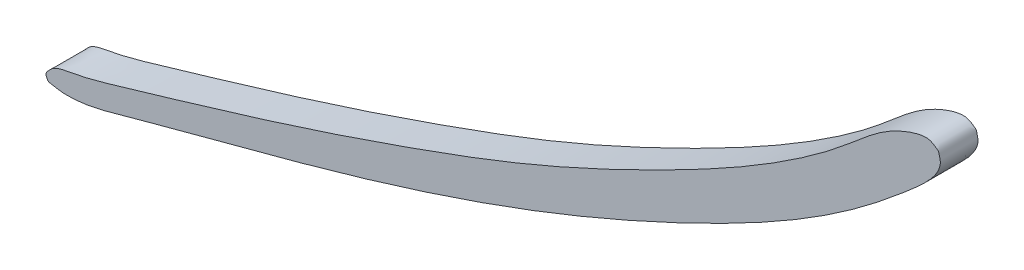
ISO-10303-21;
HEADER;
FILE_DESCRIPTION(('STEP AP214'),'2;1');
FILE_NAME('part.step','',(''),(''),'','','');
FILE_SCHEMA(('AUTOMOTIVE_DESIGN { 1 0 10303 214 1 1 1 1 }'));
ENDSEC;
DATA;
#1=APPLICATION_CONTEXT('core data for automotive mechanical design processes');
#2=APPLICATION_PROTOCOL_DEFINITION('international standard','automotive_design',2000,#1);
#3=PRODUCT_CONTEXT('',#1,'mechanical');
#4=PRODUCT('Part','Part','',(#3));
#5=PRODUCT_RELATED_PRODUCT_CATEGORY('part','',(#4));
#6=PRODUCT_DEFINITION_FORMATION('','',#4);
#7=PRODUCT_DEFINITION_CONTEXT('part definition',#1,'design');
#8=PRODUCT_DEFINITION('design','',#6,#7);
#9=PRODUCT_DEFINITION_SHAPE('','',#8);
#10=(LENGTH_UNIT() NAMED_UNIT(*) SI_UNIT(.MILLI.,.METRE.));
#11=(NAMED_UNIT(*) PLANE_ANGLE_UNIT() SI_UNIT($,.RADIAN.));
#12=(NAMED_UNIT(*) SI_UNIT($,.STERADIAN.) SOLID_ANGLE_UNIT());
#13=UNCERTAINTY_MEASURE_WITH_UNIT(LENGTH_MEASURE(1.E-05),#10,'distance_accuracy_value','');
#14=(GEOMETRIC_REPRESENTATION_CONTEXT(3) GLOBAL_UNCERTAINTY_ASSIGNED_CONTEXT((#13)) GLOBAL_UNIT_ASSIGNED_CONTEXT((#10,
#11,#12)) REPRESENTATION_CONTEXT('',''));
#15=CARTESIAN_POINT('',(0.,0.,0.));
#16=DIRECTION('',(0.,0.,1.));
#17=DIRECTION('',(1.,0.,0.));
#18=AXIS2_PLACEMENT_3D('',#15,#16,#17);
#19=CARTESIAN_POINT('',(99.7842307095506,0.,188.));
#20=CARTESIAN_POINT('',(99.7131256875294,0.123254902032743,188.));
#21=CARTESIAN_POINT('',(99.601604895818,0.211627373297266,188.));
#22=CARTESIAN_POINT('',(99.3732442418728,0.374850026542886,188.));
#23=CARTESIAN_POINT('',(99.2541942500146,0.449183163500999,188.));
#24=CARTESIAN_POINT('',(99.0199318074573,0.603585017392203,188.));
#25=CARTESIAN_POINT('',(98.904103343236,0.682733041966382,188.));
#26=CARTESIAN_POINT('',(98.6663586725593,0.831930365914809,188.));
#27=CARTESIAN_POINT('',(98.544956132999,0.90217971931451,188.));
#28=CARTESIAN_POINT('',(98.2971974452133,1.02952206028731,188.));
#29=CARTESIAN_POINT('',(98.1704216067928,1.0863098855114,188.));
#30=CARTESIAN_POINT('',(97.9064295213056,1.17507453193224,188.));
#31=CARTESIAN_POINT('',(97.7682613757328,1.20809529123866,188.));
#32=CARTESIAN_POINT('',(97.3515697743637,1.27532921795946,188.));
#33=CARTESIAN_POINT('',(97.0729715951632,1.27911444627443,188.));
#34=CARTESIAN_POINT('',(96.5149921440858,1.24670362989211,188.));
#35=CARTESIAN_POINT('',(96.2355446625707,1.20917354148847,188.));
#36=CARTESIAN_POINT('',(95.6863130491497,1.1147146675004,188.));
#37=CARTESIAN_POINT('',(95.4148553482006,1.0565727904916,188.));
#38=CARTESIAN_POINT('',(94.6088222964166,0.85332915467946,188.));
#39=CARTESIAN_POINT('',(94.0817867101929,0.682174680970332,188.));
#40=CARTESIAN_POINT('',(93.0374340600245,0.306284593648871,188.));
#41=CARTESIAN_POINT('',(92.5193166450772,0.0982730212970454,188.));
#42=CARTESIAN_POINT('',(91.502323377133,-0.347867772123381,188.));
#43=CARTESIAN_POINT('',(91.0030261073154,-0.585418903489212,188.));
#44=CARTESIAN_POINT('',(89.5312304921133,-1.33915036103909,188.));
#45=CARTESIAN_POINT('',(88.5857149151656,-1.89780430860008,188.));
#46=CARTESIAN_POINT('',(85.850684718822,-3.73356349972479,188.));
#47=CARTESIAN_POINT('',(84.153381279216,-5.15616301506977,188.));
#48=CARTESIAN_POINT('',(81.6205654773531,-7.30916548573409,188.));
#49=CARTESIAN_POINT('',(80.7769218901046,-8.02779130474312,188.));
#50=CARTESIAN_POINT('',(79.074973145826,-9.4426817140586,188.));
#51=CARTESIAN_POINT('',(78.2178197139216,-10.1407028685886,188.));
#52=CARTESIAN_POINT('',(75.6148030425224,-12.1866378340533,188.));
#53=CARTESIAN_POINT('',(73.8396407774922,-13.4898659653157,188.));
#54=CARTESIAN_POINT('',(70.2377976098437,-16.0177481014187,188.));
#55=CARTESIAN_POINT('',(68.4109156268312,-17.2420954266373,188.));
#56=CARTESIAN_POINT('',(64.7176541545496,-19.6305500902421,188.));
#57=CARTESIAN_POINT('',(62.8501320931751,-20.7929148242182,188.));
#58=CARTESIAN_POINT('',(59.0756226574838,-23.057453405269,188.));
#59=CARTESIAN_POINT('',(57.1691266308624,-24.1603766358237,188.));
#60=CARTESIAN_POINT('',(53.3255113926452,-26.3195178632503,188.));
#61=CARTESIAN_POINT('',(51.3886311299022,-27.3761002951738,188.));
#62=CARTESIAN_POINT('',(47.4927164612019,-29.4554765626764,188.));
#63=CARTESIAN_POINT('',(45.5329225397239,-30.4782096549606,188.));
#64=CARTESIAN_POINT('',(39.6319997126305,-33.501204666838,188.));
#65=CARTESIAN_POINT('',(35.6665994422997,-35.4557603251591,188.));
#66=CARTESIAN_POINT('',(27.6877225915225,-39.2592702868246,188.));
#67=CARTESIAN_POINT('',(23.6744171016101,-41.1090121566025,188.));
#68=CARTESIAN_POINT('',(15.5840408505414,-44.6695332628869,188.));
#69=CARTESIAN_POINT('',(11.5052711721854,-46.3764778406774,188.));
#70=CARTESIAN_POINT('',(3.29269973755621,-49.6419268020293,188.));
#71=CARTESIAN_POINT('',(-0.841544101254448,-51.2033575819866,188.));
#72=CARTESIAN_POINT('',(-9.14298718641138,-54.242182274037,188.));
#73=CARTESIAN_POINT('',(-13.3074882168016,-55.7214182871307,188.));
#74=CARTESIAN_POINT('',(-21.6541295206776,-58.6263659252816,188.));
#75=CARTESIAN_POINT('',(-25.8371504745589,-60.0499029227589,188.));
#76=CARTESIAN_POINT('',(-34.2269979369363,-62.8259629337181,188.));
#77=CARTESIAN_POINT('',(-38.4339868967335,-64.1780013412219,188.));
#78=CARTESIAN_POINT('',(-46.8694283241486,-66.8180506960207,188.));
#79=CARTESIAN_POINT('',(-51.0974568812443,-68.107524457408,188.));
#80=CARTESIAN_POINT('',(-57.445816612963,-70.0194867218374,188.));
#81=CARTESIAN_POINT('',(-59.5630118629135,-70.653234968966,188.));
#82=CARTESIAN_POINT('',(-63.7979782741448,-71.9187941535666,188.));
#83=CARTESIAN_POINT('',(-65.9157496665391,-72.5506126440865,188.));
#84=CARTESIAN_POINT('',(-70.1530695373074,-73.8082664770458,188.));
#85=CARTESIAN_POINT('',(-72.272866084248,-74.4332591788246,188.));
#86=CARTESIAN_POINT('',(-75.4554102007939,-75.3610160285518,188.));
#87=CARTESIAN_POINT('',(-76.5160491618543,-75.6710668354232,188.));
#88=CARTESIAN_POINT('',(-78.6412754197292,-76.2769712689468,188.));
#89=CARTESIAN_POINT('',(-79.7072415266158,-76.5693403689131,188.));
#90=CARTESIAN_POINT('',(-81.3183996551675,-76.9593978244111,188.));
#91=CARTESIAN_POINT('',(-81.8570399022285,-77.0816631503639,188.));
#92=CARTESIAN_POINT('',(-82.9379374369105,-77.3085275097041,188.));
#93=CARTESIAN_POINT('',(-83.4804576501506,-77.4118423659221,188.));
#94=CARTESIAN_POINT('',(-84.5684537011718,-77.6040362635022,188.));
#95=CARTESIAN_POINT('',(-85.1133468107151,-77.6957614569497,188.));
#96=CARTESIAN_POINT('',(-85.9240099513167,-77.8659586191418,188.));
#97=CARTESIAN_POINT('',(-86.1933039971211,-77.9278241316213,188.));
#98=CARTESIAN_POINT('',(-86.7259245508629,-78.0679778104867,188.));
#99=CARTESIAN_POINT('',(-86.9896589540913,-78.1457486894914,188.));
#100=CARTESIAN_POINT('',(-87.5069717319422,-78.3316261303947,188.));
#101=CARTESIAN_POINT('',(-87.7618125824687,-78.4401083865574,188.));
#102=CARTESIAN_POINT('',(-88.2494486182274,-78.7052487142106,188.));
#103=CARTESIAN_POINT('',(-88.4745685101383,-78.860474530986,188.));
#104=CARTESIAN_POINT('',(-88.8873467186841,-79.2163166196969,188.));
#105=CARTESIAN_POINT('',(-89.0776869242753,-79.4136833710369,188.));
#106=CARTESIAN_POINT('',(-89.3515667765894,-79.723825582829,188.));
#107=CARTESIAN_POINT('',(-89.4434616450909,-79.8268206135513,188.));
#108=CARTESIAN_POINT('',(-89.573034610072,-79.9877259549994,188.));
#109=CARTESIAN_POINT('',(-89.6149086705801,-80.0423921265352,188.));
#110=CARTESIAN_POINT('',(-89.6920701464662,-80.156881328784,188.));
#111=CARTESIAN_POINT('',(-89.727408079426,-80.2177549976445,188.));
#112=CARTESIAN_POINT('',(-89.7789777985659,-80.3459510228897,188.));
#113=CARTESIAN_POINT('',(-89.7945655033695,-80.4151381166068,188.));
#114=CARTESIAN_POINT('',(-89.8007362395885,-80.5534027604245,188.));
#115=CARTESIAN_POINT('',(-89.79304806357,-80.6232823195014,188.));
#116=CARTESIAN_POINT('',(-89.7511794046847,-80.8266782955336,188.));
#117=CARTESIAN_POINT('',(-89.7020920328425,-80.9550204772416,188.));
#118=CARTESIAN_POINT('',(-89.594539651813,-81.2084917947264,188.));
#119=CARTESIAN_POINT('',(-89.5353022284484,-81.3340936066089,188.));
#120=CARTESIAN_POINT('',(-89.4140825340137,-81.5023599879631,188.));
#121=CARTESIAN_POINT('',(-89.3675251553206,-81.5536706551477,188.));
#122=CARTESIAN_POINT('',(-89.2607746797731,-81.6401861824673,188.));
#123=CARTESIAN_POINT('',(-89.2002514914872,-81.6756435888439,188.));
#124=CARTESIAN_POINT('',(-89.0091422032274,-81.7513215700416,188.));
#125=CARTESIAN_POINT('',(-88.8700203294141,-81.7696148585663,188.));
#126=CARTESIAN_POINT('',(-88.5968237426901,-81.8061456064523,188.));
#127=CARTESIAN_POINT('',(-88.4602191518904,-81.8243726099333,188.));
#128=CARTESIAN_POINT('',(-88.0525311576045,-81.8920060451256,188.));
#129=CARTESIAN_POINT('',(-87.7820737999529,-81.9462485517196,188.));
#130=CARTESIAN_POINT('',(-87.2402843051619,-82.0493450573704,188.));
#131=CARTESIAN_POINT('',(-86.9690134595939,-82.0955180439386,188.));
#132=CARTESIAN_POINT('',(-86.4245497545988,-82.1603942312589,188.));
#133=CARTESIAN_POINT('',(-86.1514894441386,-82.1809918469312,188.));
#134=CARTESIAN_POINT('',(-85.33060578553,-82.218448994168,188.));
#135=CARTESIAN_POINT('',(-84.7810224764575,-82.2101548311329,188.));
#136=CARTESIAN_POINT('',(-83.1287942097005,-82.1355592550566,188.));
#137=CARTESIAN_POINT('',(-82.0392605073339,-82.0089560949305,188.));
#138=CARTESIAN_POINT('',(-79.8885519166008,-81.6462827244847,188.));
#139=CARTESIAN_POINT('',(-78.8245237017371,-81.4128678886996,188.));
#140=CARTESIAN_POINT('',(-76.7055797033486,-80.9041385881154,188.));
#141=CARTESIAN_POINT('',(-75.6511217779494,-80.626718858004,188.));
#142=CARTESIAN_POINT('',(-72.493178461125,-79.7694900163616,188.));
#143=CARTESIAN_POINT('',(-70.3941981872634,-79.169613647268,188.));
#144=CARTESIAN_POINT('',(-66.1897203959738,-77.9964498484194,188.));
#145=CARTESIAN_POINT('',(-64.0852759080559,-77.4177181782093,188.));
#146=CARTESIAN_POINT('',(-57.7646771548205,-75.7085072684351,188.));
#147=CARTESIAN_POINT('',(-53.5423120148818,-74.6011184388301,188.));
#148=CARTESIAN_POINT('',(-45.1022321165922,-72.3693398644863,188.));
#149=CARTESIAN_POINT('',(-40.8847271684175,-71.2441908668252,188.));
#150=CARTESIAN_POINT('',(-28.2589106894526,-67.7712215696958,188.));
#151=CARTESIAN_POINT('',(-19.875339701786,-65.3283094019783,188.));
#152=CARTESIAN_POINT('',(-3.23992703481544,-60.0343950912721,188.));
#153=CARTESIAN_POINT('',(5.01758806745221,-57.1879757049324,188.));
#154=CARTESIAN_POINT('',(21.3355585379873,-50.9902161158089,188.));
#155=CARTESIAN_POINT('',(29.4019896576499,-47.6306463655094,188.));
#156=CARTESIAN_POINT('',(41.3382897807824,-42.2489834908002,188.));
#157=CARTESIAN_POINT('',(45.2865889010663,-40.3995836285443,188.));
#158=CARTESIAN_POINT('',(53.1145236191035,-36.5756783055211,188.));
#159=CARTESIAN_POINT('',(56.9941717253256,-34.6011956353048,188.));
#160=CARTESIAN_POINT('',(64.6549676114529,-30.4727617528685,188.));
#161=CARTESIAN_POINT('',(68.4353652336109,-28.3174437460177,188.));
#162=CARTESIAN_POINT('',(73.9915478139263,-24.8760035951951,188.));
#163=CARTESIAN_POINT('',(75.824545282251,-23.6941231950637,188.));
#164=CARTESIAN_POINT('',(79.446862138623,-21.250780512405,188.));
#165=CARTESIAN_POINT('',(81.2375268316906,-19.9883679534997,188.));
#166=CARTESIAN_POINT('',(86.5320681560459,-16.0833038422977,188.));
#167=CARTESIAN_POINT('',(89.9477352709323,-13.3285576363736,188.));
#168=CARTESIAN_POINT('',(94.0945812740616,-9.74149913812372,188.));
#169=CARTESIAN_POINT('',(94.9178361276549,-9.01716711202919,188.));
#170=CARTESIAN_POINT('',(96.1285671706991,-7.90385270258838,188.));
#171=CARTESIAN_POINT('',(96.527222531317,-7.52686604757932,188.));
#172=CARTESIAN_POINT('',(97.3053725664275,-6.75550958498855,188.));
#173=CARTESIAN_POINT('',(97.6859405738645,-6.36189482318441,188.));
#174=CARTESIAN_POINT('',(98.4098545118768,-5.5399393330491,188.));
#175=CARTESIAN_POINT('',(98.7548191230851,-5.10939331166994,188.));
#176=CARTESIAN_POINT('',(99.215480495177,-4.42986598460179,188.));
#177=CARTESIAN_POINT('',(99.3594628541622,-4.19752470190697,188.));
#178=CARTESIAN_POINT('',(99.622130691411,-3.71742795333504,188.));
#179=CARTESIAN_POINT('',(99.7410673588973,-3.46837128191175,188.));
#180=CARTESIAN_POINT('',(99.9470977127987,-2.95827160543237,188.));
#181=CARTESIAN_POINT('',(100.03391398945,-2.69814216960214,188.));
#182=CARTESIAN_POINT('',(100.151733120624,-2.16038150959106,188.));
#183=CARTESIAN_POINT('',(100.182523569967,-1.88436658720554,188.));
#184=CARTESIAN_POINT('',(100.141597271897,-1.34064664206527,188.));
#185=CARTESIAN_POINT('',(100.066663842603,-1.07070431883325,188.));
#186=CARTESIAN_POINT('',(99.9616704720205,-0.668951885081936,188.));
#187=CARTESIAN_POINT('',(99.9324620177029,-0.533533210844744,188.));
#188=CARTESIAN_POINT('',(99.8772158156909,-0.261873686352662,188.));
#189=CARTESIAN_POINT('',(99.8553357315718,-0.123254902032733,188.));
#190=CARTESIAN_POINT('',(99.7842307095506,0.,188.));
#191=B_SPLINE_CURVE_WITH_KNOTS('',3,(#19,#20,#21,#22,#23,#24,#25,#26,#27,#28,#29,#30,#31,#32,
#33,#34,#35,#36,#37,#38,#39,#40,#41,#42,#43,#44,#45,#46,#47,#48,#49,#50,#51,#52,#53,#54,#55,#56,
#57,#58,#59,#60,#61,#62,#63,#64,#65,#66,#67,#68,#69,#70,#71,#72,#73,#74,#75,#76,#77,#78,#79,#80,
#81,#82,#83,#84,#85,#86,#87,#88,#89,#90,#91,#92,#93,#94,#95,#96,#97,#98,#99,#100,#101,#102,#103,
#104,#105,#106,#107,#108,#109,#110,#111,#112,#113,#114,#115,#116,#117,#118,#119,#120,#121,#122,
#123,#124,#125,#126,#127,#128,#129,#130,#131,#132,#133,#134,#135,#136,#137,#138,#139,#140,#141,
#142,#143,#144,#145,#146,#147,#148,#149,#150,#151,#152,#153,#154,#155,#156,#157,#158,#159,#160,
#161,#162,#163,#164,#165,#166,#167,#168,#169,#170,#171,#172,#173,#174,#175,#176,#177,#178,#179,
#180,#181,#182,#183,#184,#185,#186,#187,#188,#189,#190),.UNSPECIFIED.,.T.,.F.,(4,2,2,2,2,2,2,2,
2,2,2,2,2,2,2,2,2,2,2,2,2,2,2,2,2,2,2,2,2,2,2,2,2,2,2,2,2,2,2,2,2,2,2,2,2,2,2,2,2,2,2,2,2,2,2,2,
2,2,2,2,2,2,2,2,2,2,2,2,2,2,2,2,2,2,2,2,2,2,2,2,2,2,2,2,2,4),(0.,0.000976562499999891,
0.00195312499999978,0.00292968749999967,0.00390624999999956,0.00488281249999945,
0.00585937499999935,0.00781249999999922,0.0097656249999991,0.011718749999999,0.0156249999999988,
0.0195312499999987,0.0234374999999985,0.0312499999999982,0.0468749999999977,0.0546874999999974,
0.0624999999999972,0.0781249999999965,0.0937499999999959,0.109374999999995,0.124999999999995,
0.140624999999994,0.156249999999994,0.187499999999992,0.218749999999991,0.24999999999999,
0.281249999999989,0.312499999999988,0.343749999999986,0.374999999999985,0.406249999999984,
0.421874999999983,0.437499999999983,0.453124999999982,0.460937499999982,0.468749999999981,
0.472656249999981,0.476562499999981,0.480468749999981,0.482421874999981,0.484374999999981,
0.486328124999981,0.48828124999998,0.49023437499998,0.49121093749998,0.49169921874998,
0.49218749999998,0.49267578124998,0.49316406249998,0.49414062499998,0.49511718749998,
0.49560546874998,0.49609374999998,0.49707031249998,0.49804687499998,0.49999999999998,
0.50195312499998,0.50390624999998,0.50781249999998,0.515624999999981,0.523437499999981,
0.531249999999982,0.546874999999982,0.562499999999983,0.593749999999984,0.624999999999985,
0.687499999999988,0.74999999999999,0.812499999999993,0.843749999999994,0.874999999999995,
0.906249999999996,0.921874999999997,0.937499999999998,0.968749999999999,0.976562499999999,
0.980468749999999,0.984374999999999,0.988281249999999,0.990234375,0.9921875,0.994140625,
0.99609375,0.998046875,0.9990234375,1.),.UNSPECIFIED.);
#192=DIRECTION('',(0.,0.,-1.));
#193=VECTOR('',#192,1.);
#194=SURFACE_OF_LINEAR_EXTRUSION('',#191,#193);
#195=CARTESIAN_POINT('',(99.7842307095506,0.,188.));
#196=CARTESIAN_POINT('',(99.8553357315718,-0.123254902032733,188.));
#197=CARTESIAN_POINT('',(99.8772158156909,-0.261873686352662,188.));
#198=CARTESIAN_POINT('',(99.9324620177029,-0.533533210844744,188.));
#199=CARTESIAN_POINT('',(99.9616704720205,-0.668951885081936,188.));
#200=CARTESIAN_POINT('',(100.066663842603,-1.07070431883325,188.));
#201=CARTESIAN_POINT('',(100.141597271897,-1.34064664206527,188.));
#202=CARTESIAN_POINT('',(100.182523569967,-1.88436658720554,188.));
#203=CARTESIAN_POINT('',(100.151733120624,-2.16038150959106,188.));
#204=CARTESIAN_POINT('',(100.03391398945,-2.69814216960214,188.));
#205=CARTESIAN_POINT('',(99.9470977127987,-2.95827160543237,188.));
#206=CARTESIAN_POINT('',(99.7410673588973,-3.46837128191175,188.));
#207=CARTESIAN_POINT('',(99.622130691411,-3.71742795333504,188.));
#208=CARTESIAN_POINT('',(99.3594628541622,-4.19752470190697,188.));
#209=CARTESIAN_POINT('',(99.215480495177,-4.42986598460179,188.));
#210=CARTESIAN_POINT('',(98.7548191230851,-5.10939331166994,188.));
#211=CARTESIAN_POINT('',(98.4098545118768,-5.5399393330491,188.));
#212=CARTESIAN_POINT('',(97.6859405738645,-6.36189482318441,188.));
#213=CARTESIAN_POINT('',(97.3053725664275,-6.75550958498855,188.));
#214=CARTESIAN_POINT('',(96.527222531317,-7.52686604757932,188.));
#215=CARTESIAN_POINT('',(96.1285671706991,-7.90385270258838,188.));
#216=CARTESIAN_POINT('',(94.9178361276549,-9.01716711202919,188.));
#217=CARTESIAN_POINT('',(94.0945812740616,-9.74149913812372,188.));
#218=CARTESIAN_POINT('',(89.9477352709323,-13.3285576363736,188.));
#219=CARTESIAN_POINT('',(86.5320681560459,-16.0833038422977,188.));
#220=CARTESIAN_POINT('',(81.2375268316906,-19.9883679534997,188.));
#221=CARTESIAN_POINT('',(79.446862138623,-21.250780512405,188.));
#222=CARTESIAN_POINT('',(75.824545282251,-23.6941231950637,188.));
#223=CARTESIAN_POINT('',(73.9915478139263,-24.8760035951951,188.));
#224=CARTESIAN_POINT('',(68.4353652336109,-28.3174437460177,188.));
#225=CARTESIAN_POINT('',(64.6549676114529,-30.4727617528685,188.));
#226=CARTESIAN_POINT('',(56.9941717253256,-34.6011956353048,188.));
#227=CARTESIAN_POINT('',(53.1145236191035,-36.5756783055211,188.));
#228=CARTESIAN_POINT('',(45.2865889010663,-40.3995836285443,188.));
#229=CARTESIAN_POINT('',(41.3382897807824,-42.2489834908002,188.));
#230=CARTESIAN_POINT('',(29.4019896576499,-47.6306463655094,188.));
#231=CARTESIAN_POINT('',(21.3355585379873,-50.9902161158089,188.));
#232=CARTESIAN_POINT('',(5.01758806745221,-57.1879757049324,188.));
#233=CARTESIAN_POINT('',(-3.23992703481544,-60.0343950912721,188.));
#234=CARTESIAN_POINT('',(-19.875339701786,-65.3283094019783,188.));
#235=CARTESIAN_POINT('',(-28.2589106894526,-67.7712215696958,188.));
#236=CARTESIAN_POINT('',(-40.8847271684175,-71.2441908668252,188.));
#237=CARTESIAN_POINT('',(-45.1022321165922,-72.3693398644863,188.));
#238=CARTESIAN_POINT('',(-53.5423120148818,-74.6011184388301,188.));
#239=CARTESIAN_POINT('',(-57.7646771548205,-75.7085072684351,188.));
#240=CARTESIAN_POINT('',(-64.0852759080559,-77.4177181782093,188.));
#241=CARTESIAN_POINT('',(-66.1897203959738,-77.9964498484194,188.));
#242=CARTESIAN_POINT('',(-70.3941981872634,-79.169613647268,188.));
#243=CARTESIAN_POINT('',(-72.493178461125,-79.7694900163616,188.));
#244=CARTESIAN_POINT('',(-75.6511217779494,-80.626718858004,188.));
#245=CARTESIAN_POINT('',(-76.7055797033486,-80.9041385881154,188.));
#246=CARTESIAN_POINT('',(-78.8245237017371,-81.4128678886996,188.));
#247=CARTESIAN_POINT('',(-79.8885519166008,-81.6462827244847,188.));
#248=CARTESIAN_POINT('',(-82.0392605073339,-82.0089560949305,188.));
#249=CARTESIAN_POINT('',(-83.1287942097005,-82.1355592550566,188.));
#250=CARTESIAN_POINT('',(-84.7810224764575,-82.2101548311329,188.));
#251=CARTESIAN_POINT('',(-85.33060578553,-82.218448994168,188.));
#252=CARTESIAN_POINT('',(-86.1514894441386,-82.1809918469312,188.));
#253=CARTESIAN_POINT('',(-86.4245497545988,-82.1603942312589,188.));
#254=CARTESIAN_POINT('',(-86.9690134595939,-82.0955180439386,188.));
#255=CARTESIAN_POINT('',(-87.2402843051619,-82.0493450573704,188.));
#256=CARTESIAN_POINT('',(-87.7820737999529,-81.9462485517196,188.));
#257=CARTESIAN_POINT('',(-88.0525311576045,-81.8920060451256,188.));
#258=CARTESIAN_POINT('',(-88.4602191518904,-81.8243726099333,188.));
#259=CARTESIAN_POINT('',(-88.5968237426901,-81.8061456064523,188.));
#260=CARTESIAN_POINT('',(-88.8700203294141,-81.7696148585663,188.));
#261=CARTESIAN_POINT('',(-89.0091422032274,-81.7513215700416,188.));
#262=CARTESIAN_POINT('',(-89.2002514914872,-81.6756435888439,188.));
#263=CARTESIAN_POINT('',(-89.2607746797731,-81.6401861824673,188.));
#264=CARTESIAN_POINT('',(-89.3675251553206,-81.5536706551477,188.));
#265=CARTESIAN_POINT('',(-89.4140825340137,-81.5023599879631,188.));
#266=CARTESIAN_POINT('',(-89.5353022284484,-81.3340936066089,188.));
#267=CARTESIAN_POINT('',(-89.594539651813,-81.2084917947264,188.));
#268=CARTESIAN_POINT('',(-89.7020920328425,-80.9550204772416,188.));
#269=CARTESIAN_POINT('',(-89.7511794046847,-80.8266782955336,188.));
#270=CARTESIAN_POINT('',(-89.79304806357,-80.6232823195014,188.));
#271=CARTESIAN_POINT('',(-89.8007362395885,-80.5534027604245,188.));
#272=CARTESIAN_POINT('',(-89.7945655033695,-80.4151381166068,188.));
#273=CARTESIAN_POINT('',(-89.7789777985659,-80.3459510228897,188.));
#274=CARTESIAN_POINT('',(-89.727408079426,-80.2177549976445,188.));
#275=CARTESIAN_POINT('',(-89.6920701464662,-80.156881328784,188.));
#276=CARTESIAN_POINT('',(-89.6149086705801,-80.0423921265352,188.));
#277=CARTESIAN_POINT('',(-89.573034610072,-79.9877259549994,188.));
#278=CARTESIAN_POINT('',(-89.4434616450909,-79.8268206135513,188.));
#279=CARTESIAN_POINT('',(-89.3515667765894,-79.723825582829,188.));
#280=CARTESIAN_POINT('',(-89.0776869242753,-79.4136833710369,188.));
#281=CARTESIAN_POINT('',(-88.8873467186841,-79.2163166196969,188.));
#282=CARTESIAN_POINT('',(-88.4745685101383,-78.860474530986,188.));
#283=CARTESIAN_POINT('',(-88.2494486182274,-78.7052487142106,188.));
#284=CARTESIAN_POINT('',(-87.7618125824687,-78.4401083865574,188.));
#285=CARTESIAN_POINT('',(-87.5069717319422,-78.3316261303947,188.));
#286=CARTESIAN_POINT('',(-86.9896589540913,-78.1457486894914,188.));
#287=CARTESIAN_POINT('',(-86.7259245508629,-78.0679778104867,188.));
#288=CARTESIAN_POINT('',(-86.1933039971211,-77.9278241316213,188.));
#289=CARTESIAN_POINT('',(-85.9240099513167,-77.8659586191418,188.));
#290=CARTESIAN_POINT('',(-85.1133468107151,-77.6957614569497,188.));
#291=CARTESIAN_POINT('',(-84.5684537011718,-77.6040362635022,188.));
#292=CARTESIAN_POINT('',(-83.4804576501506,-77.4118423659221,188.));
#293=CARTESIAN_POINT('',(-82.9379374369105,-77.3085275097041,188.));
#294=CARTESIAN_POINT('',(-81.8570399022285,-77.0816631503639,188.));
#295=CARTESIAN_POINT('',(-81.3183996551675,-76.9593978244111,188.));
#296=CARTESIAN_POINT('',(-79.7072415266158,-76.5693403689131,188.));
#297=CARTESIAN_POINT('',(-78.6412754197292,-76.2769712689468,188.));
#298=CARTESIAN_POINT('',(-76.5160491618543,-75.6710668354232,188.));
#299=CARTESIAN_POINT('',(-75.4554102007939,-75.3610160285518,188.));
#300=CARTESIAN_POINT('',(-72.272866084248,-74.4332591788246,188.));
#301=CARTESIAN_POINT('',(-70.1530695373074,-73.8082664770458,188.));
#302=CARTESIAN_POINT('',(-65.9157496665391,-72.5506126440865,188.));
#303=CARTESIAN_POINT('',(-63.7979782741448,-71.9187941535666,188.));
#304=CARTESIAN_POINT('',(-59.5630118629135,-70.653234968966,188.));
#305=CARTESIAN_POINT('',(-57.445816612963,-70.0194867218374,188.));
#306=CARTESIAN_POINT('',(-51.0974568812443,-68.107524457408,188.));
#307=CARTESIAN_POINT('',(-46.8694283241486,-66.8180506960207,188.));
#308=CARTESIAN_POINT('',(-38.4339868967335,-64.1780013412219,188.));
#309=CARTESIAN_POINT('',(-34.2269979369363,-62.8259629337181,188.));
#310=CARTESIAN_POINT('',(-25.8371504745589,-60.0499029227589,188.));
#311=CARTESIAN_POINT('',(-21.6541295206776,-58.6263659252816,188.));
#312=CARTESIAN_POINT('',(-13.3074882168016,-55.7214182871307,188.));
#313=CARTESIAN_POINT('',(-9.14298718641138,-54.242182274037,188.));
#314=CARTESIAN_POINT('',(-0.841544101254448,-51.2033575819866,188.));
#315=CARTESIAN_POINT('',(3.29269973755621,-49.6419268020293,188.));
#316=CARTESIAN_POINT('',(11.5052711721854,-46.3764778406774,188.));
#317=CARTESIAN_POINT('',(15.5840408505414,-44.6695332628869,188.));
#318=CARTESIAN_POINT('',(23.6744171016101,-41.1090121566025,188.));
#319=CARTESIAN_POINT('',(27.6877225915225,-39.2592702868246,188.));
#320=CARTESIAN_POINT('',(35.6665994422997,-35.4557603251591,188.));
#321=CARTESIAN_POINT('',(39.6319997126305,-33.501204666838,188.));
#322=CARTESIAN_POINT('',(45.5329225397239,-30.4782096549606,188.));
#323=CARTESIAN_POINT('',(47.4927164612019,-29.4554765626764,188.));
#324=CARTESIAN_POINT('',(51.3886311299022,-27.3761002951738,188.));
#325=CARTESIAN_POINT('',(53.3255113926452,-26.3195178632503,188.));
#326=CARTESIAN_POINT('',(57.1691266308624,-24.1603766358237,188.));
#327=CARTESIAN_POINT('',(59.0756226574838,-23.057453405269,188.));
#328=CARTESIAN_POINT('',(62.8501320931751,-20.7929148242182,188.));
#329=CARTESIAN_POINT('',(64.7176541545496,-19.6305500902421,188.));
#330=CARTESIAN_POINT('',(68.4109156268312,-17.2420954266373,188.));
#331=CARTESIAN_POINT('',(70.2377976098437,-16.0177481014187,188.));
#332=CARTESIAN_POINT('',(73.8396407774922,-13.4898659653157,188.));
#333=CARTESIAN_POINT('',(75.6148030425224,-12.1866378340533,188.));
#334=CARTESIAN_POINT('',(78.2178197139216,-10.1407028685886,188.));
#335=CARTESIAN_POINT('',(79.074973145826,-9.4426817140586,188.));
#336=CARTESIAN_POINT('',(80.7769218901046,-8.02779130474312,188.));
#337=CARTESIAN_POINT('',(81.6205654773531,-7.30916548573409,188.));
#338=CARTESIAN_POINT('',(84.153381279216,-5.15616301506977,188.));
#339=CARTESIAN_POINT('',(85.850684718822,-3.73356349972479,188.));
#340=CARTESIAN_POINT('',(88.5857149151656,-1.89780430860008,188.));
#341=CARTESIAN_POINT('',(89.5312304921133,-1.33915036103909,188.));
#342=CARTESIAN_POINT('',(91.0030261073154,-0.585418903489212,188.));
#343=CARTESIAN_POINT('',(91.502323377133,-0.347867772123381,188.));
#344=CARTESIAN_POINT('',(92.5193166450772,0.0982730212970454,188.));
#345=CARTESIAN_POINT('',(93.0374340600245,0.306284593648871,188.));
#346=CARTESIAN_POINT('',(94.0817867101929,0.682174680970332,188.));
#347=CARTESIAN_POINT('',(94.6088222964166,0.85332915467946,188.));
#348=CARTESIAN_POINT('',(95.4148553482006,1.0565727904916,188.));
#349=CARTESIAN_POINT('',(95.6863130491497,1.1147146675004,188.));
#350=CARTESIAN_POINT('',(96.2355446625707,1.20917354148847,188.));
#351=CARTESIAN_POINT('',(96.5149921440858,1.24670362989211,188.));
#352=CARTESIAN_POINT('',(97.0729715951632,1.27911444627443,188.));
#353=CARTESIAN_POINT('',(97.3515697743637,1.27532921795946,188.));
#354=CARTESIAN_POINT('',(97.7682613757328,1.20809529123866,188.));
#355=CARTESIAN_POINT('',(97.9064295213056,1.17507453193224,188.));
#356=CARTESIAN_POINT('',(98.1704216067928,1.0863098855114,188.));
#357=CARTESIAN_POINT('',(98.2971974452133,1.02952206028731,188.));
#358=CARTESIAN_POINT('',(98.544956132999,0.90217971931451,188.));
#359=CARTESIAN_POINT('',(98.6663586725593,0.831930365914809,188.));
#360=CARTESIAN_POINT('',(98.904103343236,0.682733041966382,188.));
#361=CARTESIAN_POINT('',(99.0199318074573,0.603585017392203,188.));
#362=CARTESIAN_POINT('',(99.2541942500146,0.449183163500999,188.));
#363=CARTESIAN_POINT('',(99.3732442418728,0.374850026542886,188.));
#364=CARTESIAN_POINT('',(99.601604895818,0.211627373297266,188.));
#365=CARTESIAN_POINT('',(99.7131256875294,0.123254902032743,188.));
#366=CARTESIAN_POINT('',(99.7842307095506,0.,188.));
#367=B_SPLINE_CURVE_WITH_KNOTS('',3,(#195,#196,#197,#198,#199,#200,#201,#202,#203,#204,#205,
#206,#207,#208,#209,#210,#211,#212,#213,#214,#215,#216,#217,#218,#219,#220,#221,#222,#223,#224,
#225,#226,#227,#228,#229,#230,#231,#232,#233,#234,#235,#236,#237,#238,#239,#240,#241,#242,#243,
#244,#245,#246,#247,#248,#249,#250,#251,#252,#253,#254,#255,#256,#257,#258,#259,#260,#261,#262,
#263,#264,#265,#266,#267,#268,#269,#270,#271,#272,#273,#274,#275,#276,#277,#278,#279,#280,#281,
#282,#283,#284,#285,#286,#287,#288,#289,#290,#291,#292,#293,#294,#295,#296,#297,#298,#299,#300,
#301,#302,#303,#304,#305,#306,#307,#308,#309,#310,#311,#312,#313,#314,#315,#316,#317,#318,#319,
#320,#321,#322,#323,#324,#325,#326,#327,#328,#329,#330,#331,#332,#333,#334,#335,#336,#337,#338,
#339,#340,#341,#342,#343,#344,#345,#346,#347,#348,#349,#350,#351,#352,#353,#354,#355,#356,#357,
#358,#359,#360,#361,#362,#363,#364,#365,#366),.UNSPECIFIED.,.T.,.F.,(4,2,2,2,2,2,2,2,2,2,2,2,2,
2,2,2,2,2,2,2,2,2,2,2,2,2,2,2,2,2,2,2,2,2,2,2,2,2,2,2,2,2,2,2,2,2,2,2,2,2,2,2,2,2,2,2,2,2,2,2,2,
2,2,2,2,2,2,2,2,2,2,2,2,2,2,2,2,2,2,2,2,2,2,2,2,4),(0.,0.0009765625,0.001953125,
0.00390625000000011,0.00585937500000022,0.00781250000000033,0.00976562500000044,
0.0117187500000006,0.0156250000000007,0.0195312500000008,0.0234375000000009,0.0312500000000013,
0.0625000000000024,0.0781250000000031,0.0937500000000039,0.125000000000005,0.156250000000006,
0.187500000000007,0.25000000000001,0.312500000000012,0.375000000000015,0.406250000000016,
0.437500000000017,0.453125000000018,0.468750000000018,0.476562500000019,0.484375000000019,
0.49218750000002,0.49609375000002,0.49804687500002,0.50000000000002,0.50195312500002,
0.50292968750002,0.50390625000002,0.50439453125002,0.50488281250002,0.50585937500002,
0.50683593750002,0.50732421875002,0.50781250000002,0.50830078125002,0.50878906250002,
0.50976562500002,0.51171875000002,0.51367187500002,0.515625000000019,0.517578125000019,
0.519531250000019,0.523437500000019,0.527343750000019,0.531250000000019,0.539062500000018,
0.546875000000018,0.562500000000017,0.578125000000017,0.593750000000016,0.625000000000015,
0.656250000000014,0.687500000000012,0.718750000000011,0.75000000000001,0.781250000000009,
0.812500000000008,0.843750000000006,0.859375000000006,0.875000000000005,0.890625000000005,
0.906250000000004,0.921875000000003,0.937500000000003,0.945312500000003,0.953125000000002,
0.968750000000002,0.976562500000001,0.980468750000001,0.984375000000001,0.988281250000001,
0.990234375000001,0.992187500000001,0.994140625000001,0.995117187500001,0.99609375,0.9970703125,
0.998046875,0.9990234375,1.),.UNSPECIFIED.);
#368=CARTESIAN_POINT('',(99.7842307095506,0.,188.));
#369=VERTEX_POINT('',#368);
#370=EDGE_CURVE('E10',#369,#369,#367,.F.);
#371=ORIENTED_EDGE('',*,*,#370,.F.);
#372=EDGE_LOOP('',(#371));
#373=FACE_BOUND('',#372,.T.);
#374=CARTESIAN_POINT('',(99.7842307095506,0.,180.));
#375=CARTESIAN_POINT('',(99.7131256875294,0.123254902032743,180.));
#376=CARTESIAN_POINT('',(99.601604895818,0.211627373297266,180.));
#377=CARTESIAN_POINT('',(99.3732442418728,0.374850026542886,180.));
#378=CARTESIAN_POINT('',(99.2541942500146,0.449183163500999,180.));
#379=CARTESIAN_POINT('',(99.0199318074573,0.603585017392203,180.));
#380=CARTESIAN_POINT('',(98.904103343236,0.682733041966382,180.));
#381=CARTESIAN_POINT('',(98.6663586725593,0.831930365914809,180.));
#382=CARTESIAN_POINT('',(98.544956132999,0.90217971931451,180.));
#383=CARTESIAN_POINT('',(98.2971974452133,1.02952206028731,180.));
#384=CARTESIAN_POINT('',(98.1704216067928,1.0863098855114,180.));
#385=CARTESIAN_POINT('',(97.9064295213056,1.17507453193224,180.));
#386=CARTESIAN_POINT('',(97.7682613757328,1.20809529123866,180.));
#387=CARTESIAN_POINT('',(97.3515697743637,1.27532921795946,180.));
#388=CARTESIAN_POINT('',(97.0729715951632,1.27911444627443,180.));
#389=CARTESIAN_POINT('',(96.5149921440858,1.24670362989211,180.));
#390=CARTESIAN_POINT('',(96.2355446625707,1.20917354148847,180.));
#391=CARTESIAN_POINT('',(95.6863130491497,1.1147146675004,180.));
#392=CARTESIAN_POINT('',(95.4148553482006,1.0565727904916,180.));
#393=CARTESIAN_POINT('',(94.6088222964166,0.85332915467946,180.));
#394=CARTESIAN_POINT('',(94.0817867101929,0.682174680970332,180.));
#395=CARTESIAN_POINT('',(93.0374340600245,0.306284593648871,180.));
#396=CARTESIAN_POINT('',(92.5193166450772,0.0982730212970454,180.));
#397=CARTESIAN_POINT('',(91.502323377133,-0.347867772123381,180.));
#398=CARTESIAN_POINT('',(91.0030261073154,-0.585418903489212,180.));
#399=CARTESIAN_POINT('',(89.5312304921133,-1.33915036103909,180.));
#400=CARTESIAN_POINT('',(88.5857149151656,-1.89780430860008,180.));
#401=CARTESIAN_POINT('',(85.850684718822,-3.73356349972479,180.));
#402=CARTESIAN_POINT('',(84.153381279216,-5.15616301506977,180.));
#403=CARTESIAN_POINT('',(81.6205654773531,-7.30916548573409,180.));
#404=CARTESIAN_POINT('',(80.7769218901046,-8.02779130474312,180.));
#405=CARTESIAN_POINT('',(79.074973145826,-9.4426817140586,180.));
#406=CARTESIAN_POINT('',(78.2178197139216,-10.1407028685886,180.));
#407=CARTESIAN_POINT('',(75.6148030425224,-12.1866378340533,180.));
#408=CARTESIAN_POINT('',(73.8396407774922,-13.4898659653157,180.));
#409=CARTESIAN_POINT('',(70.2377976098437,-16.0177481014187,180.));
#410=CARTESIAN_POINT('',(68.4109156268312,-17.2420954266373,180.));
#411=CARTESIAN_POINT('',(64.7176541545496,-19.6305500902421,180.));
#412=CARTESIAN_POINT('',(62.8501320931751,-20.7929148242182,180.));
#413=CARTESIAN_POINT('',(59.0756226574838,-23.057453405269,180.));
#414=CARTESIAN_POINT('',(57.1691266308624,-24.1603766358237,180.));
#415=CARTESIAN_POINT('',(53.3255113926452,-26.3195178632503,180.));
#416=CARTESIAN_POINT('',(51.3886311299022,-27.3761002951738,180.));
#417=CARTESIAN_POINT('',(47.4927164612019,-29.4554765626764,180.));
#418=CARTESIAN_POINT('',(45.5329225397239,-30.4782096549606,180.));
#419=CARTESIAN_POINT('',(39.6319997126305,-33.501204666838,180.));
#420=CARTESIAN_POINT('',(35.6665994422997,-35.4557603251591,180.));
#421=CARTESIAN_POINT('',(27.6877225915225,-39.2592702868246,180.));
#422=CARTESIAN_POINT('',(23.6744171016101,-41.1090121566025,180.));
#423=CARTESIAN_POINT('',(15.5840408505414,-44.6695332628869,180.));
#424=CARTESIAN_POINT('',(11.5052711721854,-46.3764778406774,180.));
#425=CARTESIAN_POINT('',(3.29269973755621,-49.6419268020293,180.));
#426=CARTESIAN_POINT('',(-0.841544101254448,-51.2033575819866,180.));
#427=CARTESIAN_POINT('',(-9.14298718641138,-54.242182274037,180.));
#428=CARTESIAN_POINT('',(-13.3074882168016,-55.7214182871307,180.));
#429=CARTESIAN_POINT('',(-21.6541295206776,-58.6263659252816,180.));
#430=CARTESIAN_POINT('',(-25.8371504745589,-60.0499029227589,180.));
#431=CARTESIAN_POINT('',(-34.2269979369363,-62.8259629337181,180.));
#432=CARTESIAN_POINT('',(-38.4339868967335,-64.1780013412219,180.));
#433=CARTESIAN_POINT('',(-46.8694283241486,-66.8180506960207,180.));
#434=CARTESIAN_POINT('',(-51.0974568812443,-68.107524457408,180.));
#435=CARTESIAN_POINT('',(-57.445816612963,-70.0194867218374,180.));
#436=CARTESIAN_POINT('',(-59.5630118629135,-70.653234968966,180.));
#437=CARTESIAN_POINT('',(-63.7979782741448,-71.9187941535666,180.));
#438=CARTESIAN_POINT('',(-65.9157496665391,-72.5506126440865,180.));
#439=CARTESIAN_POINT('',(-70.1530695373074,-73.8082664770458,180.));
#440=CARTESIAN_POINT('',(-72.272866084248,-74.4332591788246,180.));
#441=CARTESIAN_POINT('',(-75.4554102007939,-75.3610160285518,180.));
#442=CARTESIAN_POINT('',(-76.5160491618543,-75.6710668354232,180.));
#443=CARTESIAN_POINT('',(-78.6412754197292,-76.2769712689468,180.));
#444=CARTESIAN_POINT('',(-79.7072415266158,-76.5693403689131,180.));
#445=CARTESIAN_POINT('',(-81.3183996551675,-76.9593978244111,180.));
#446=CARTESIAN_POINT('',(-81.8570399022285,-77.0816631503639,180.));
#447=CARTESIAN_POINT('',(-82.9379374369105,-77.3085275097041,180.));
#448=CARTESIAN_POINT('',(-83.4804576501506,-77.4118423659221,180.));
#449=CARTESIAN_POINT('',(-84.5684537011718,-77.6040362635022,180.));
#450=CARTESIAN_POINT('',(-85.1133468107151,-77.6957614569497,180.));
#451=CARTESIAN_POINT('',(-85.9240099513167,-77.8659586191418,180.));
#452=CARTESIAN_POINT('',(-86.1933039971211,-77.9278241316213,180.));
#453=CARTESIAN_POINT('',(-86.7259245508629,-78.0679778104867,180.));
#454=CARTESIAN_POINT('',(-86.9896589540913,-78.1457486894914,180.));
#455=CARTESIAN_POINT('',(-87.5069717319422,-78.3316261303947,180.));
#456=CARTESIAN_POINT('',(-87.7618125824687,-78.4401083865574,180.));
#457=CARTESIAN_POINT('',(-88.2494486182274,-78.7052487142106,180.));
#458=CARTESIAN_POINT('',(-88.4745685101383,-78.860474530986,180.));
#459=CARTESIAN_POINT('',(-88.8873467186841,-79.2163166196969,180.));
#460=CARTESIAN_POINT('',(-89.0776869242753,-79.4136833710369,180.));
#461=CARTESIAN_POINT('',(-89.3515667765894,-79.723825582829,180.));
#462=CARTESIAN_POINT('',(-89.4434616450909,-79.8268206135513,180.));
#463=CARTESIAN_POINT('',(-89.573034610072,-79.9877259549994,180.));
#464=CARTESIAN_POINT('',(-89.6149086705801,-80.0423921265352,180.));
#465=CARTESIAN_POINT('',(-89.6920701464662,-80.156881328784,180.));
#466=CARTESIAN_POINT('',(-89.727408079426,-80.2177549976445,180.));
#467=CARTESIAN_POINT('',(-89.7789777985659,-80.3459510228897,180.));
#468=CARTESIAN_POINT('',(-89.7945655033695,-80.4151381166068,180.));
#469=CARTESIAN_POINT('',(-89.8007362395885,-80.5534027604245,180.));
#470=CARTESIAN_POINT('',(-89.79304806357,-80.6232823195014,180.));
#471=CARTESIAN_POINT('',(-89.7511794046847,-80.8266782955336,180.));
#472=CARTESIAN_POINT('',(-89.7020920328425,-80.9550204772416,180.));
#473=CARTESIAN_POINT('',(-89.594539651813,-81.2084917947264,180.));
#474=CARTESIAN_POINT('',(-89.5353022284484,-81.3340936066089,180.));
#475=CARTESIAN_POINT('',(-89.4140825340137,-81.5023599879631,180.));
#476=CARTESIAN_POINT('',(-89.3675251553206,-81.5536706551477,180.));
#477=CARTESIAN_POINT('',(-89.2607746797731,-81.6401861824673,180.));
#478=CARTESIAN_POINT('',(-89.2002514914872,-81.6756435888439,180.));
#479=CARTESIAN_POINT('',(-89.0091422032274,-81.7513215700416,180.));
#480=CARTESIAN_POINT('',(-88.8700203294141,-81.7696148585663,180.));
#481=CARTESIAN_POINT('',(-88.5968237426901,-81.8061456064523,180.));
#482=CARTESIAN_POINT('',(-88.4602191518904,-81.8243726099333,180.));
#483=CARTESIAN_POINT('',(-88.0525311576045,-81.8920060451256,180.));
#484=CARTESIAN_POINT('',(-87.7820737999529,-81.9462485517196,180.));
#485=CARTESIAN_POINT('',(-87.2402843051619,-82.0493450573704,180.));
#486=CARTESIAN_POINT('',(-86.9690134595939,-82.0955180439386,180.));
#487=CARTESIAN_POINT('',(-86.4245497545988,-82.1603942312589,180.));
#488=CARTESIAN_POINT('',(-86.1514894441386,-82.1809918469312,180.));
#489=CARTESIAN_POINT('',(-85.33060578553,-82.218448994168,180.));
#490=CARTESIAN_POINT('',(-84.7810224764575,-82.2101548311329,180.));
#491=CARTESIAN_POINT('',(-83.1287942097005,-82.1355592550566,180.));
#492=CARTESIAN_POINT('',(-82.0392605073339,-82.0089560949305,180.));
#493=CARTESIAN_POINT('',(-79.8885519166008,-81.6462827244847,180.));
#494=CARTESIAN_POINT('',(-78.8245237017371,-81.4128678886996,180.));
#495=CARTESIAN_POINT('',(-76.7055797033486,-80.9041385881154,180.));
#496=CARTESIAN_POINT('',(-75.6511217779494,-80.626718858004,180.));
#497=CARTESIAN_POINT('',(-72.493178461125,-79.7694900163616,180.));
#498=CARTESIAN_POINT('',(-70.3941981872634,-79.169613647268,180.));
#499=CARTESIAN_POINT('',(-66.1897203959738,-77.9964498484194,180.));
#500=CARTESIAN_POINT('',(-64.0852759080559,-77.4177181782093,180.));
#501=CARTESIAN_POINT('',(-57.7646771548205,-75.7085072684351,180.));
#502=CARTESIAN_POINT('',(-53.5423120148818,-74.6011184388301,180.));
#503=CARTESIAN_POINT('',(-45.1022321165922,-72.3693398644863,180.));
#504=CARTESIAN_POINT('',(-40.8847271684175,-71.2441908668252,180.));
#505=CARTESIAN_POINT('',(-28.2589106894526,-67.7712215696958,180.));
#506=CARTESIAN_POINT('',(-19.875339701786,-65.3283094019783,180.));
#507=CARTESIAN_POINT('',(-3.23992703481544,-60.0343950912721,180.));
#508=CARTESIAN_POINT('',(5.01758806745221,-57.1879757049324,180.));
#509=CARTESIAN_POINT('',(21.3355585379873,-50.9902161158089,180.));
#510=CARTESIAN_POINT('',(29.4019896576499,-47.6306463655094,180.));
#511=CARTESIAN_POINT('',(41.3382897807824,-42.2489834908002,180.));
#512=CARTESIAN_POINT('',(45.2865889010663,-40.3995836285443,180.));
#513=CARTESIAN_POINT('',(53.1145236191035,-36.5756783055211,180.));
#514=CARTESIAN_POINT('',(56.9941717253256,-34.6011956353048,180.));
#515=CARTESIAN_POINT('',(64.6549676114529,-30.4727617528685,180.));
#516=CARTESIAN_POINT('',(68.4353652336109,-28.3174437460177,180.));
#517=CARTESIAN_POINT('',(73.9915478139263,-24.8760035951951,180.));
#518=CARTESIAN_POINT('',(75.824545282251,-23.6941231950637,180.));
#519=CARTESIAN_POINT('',(79.446862138623,-21.250780512405,180.));
#520=CARTESIAN_POINT('',(81.2375268316906,-19.9883679534997,180.));
#521=CARTESIAN_POINT('',(86.5320681560459,-16.0833038422977,180.));
#522=CARTESIAN_POINT('',(89.9477352709323,-13.3285576363736,180.));
#523=CARTESIAN_POINT('',(94.0945812740616,-9.74149913812372,180.));
#524=CARTESIAN_POINT('',(94.9178361276549,-9.01716711202919,180.));
#525=CARTESIAN_POINT('',(96.1285671706991,-7.90385270258838,180.));
#526=CARTESIAN_POINT('',(96.527222531317,-7.52686604757932,180.));
#527=CARTESIAN_POINT('',(97.3053725664275,-6.75550958498855,180.));
#528=CARTESIAN_POINT('',(97.6859405738645,-6.36189482318441,180.));
#529=CARTESIAN_POINT('',(98.4098545118768,-5.5399393330491,180.));
#530=CARTESIAN_POINT('',(98.7548191230851,-5.10939331166994,180.));
#531=CARTESIAN_POINT('',(99.215480495177,-4.42986598460179,180.));
#532=CARTESIAN_POINT('',(99.3594628541622,-4.19752470190697,180.));
#533=CARTESIAN_POINT('',(99.622130691411,-3.71742795333504,180.));
#534=CARTESIAN_POINT('',(99.7410673588973,-3.46837128191175,180.));
#535=CARTESIAN_POINT('',(99.9470977127987,-2.95827160543237,180.));
#536=CARTESIAN_POINT('',(100.03391398945,-2.69814216960214,180.));
#537=CARTESIAN_POINT('',(100.151733120624,-2.16038150959106,180.));
#538=CARTESIAN_POINT('',(100.182523569967,-1.88436658720554,180.));
#539=CARTESIAN_POINT('',(100.141597271897,-1.34064664206527,180.));
#540=CARTESIAN_POINT('',(100.066663842603,-1.07070431883325,180.));
#541=CARTESIAN_POINT('',(99.9616704720205,-0.668951885081936,180.));
#542=CARTESIAN_POINT('',(99.9324620177029,-0.533533210844744,180.));
#543=CARTESIAN_POINT('',(99.8772158156909,-0.261873686352662,180.));
#544=CARTESIAN_POINT('',(99.8553357315718,-0.123254902032733,180.));
#545=CARTESIAN_POINT('',(99.7842307095506,0.,180.));
#546=B_SPLINE_CURVE_WITH_KNOTS('',3,(#374,#375,#376,#377,#378,#379,#380,#381,#382,#383,#384,
#385,#386,#387,#388,#389,#390,#391,#392,#393,#394,#395,#396,#397,#398,#399,#400,#401,#402,#403,
#404,#405,#406,#407,#408,#409,#410,#411,#412,#413,#414,#415,#416,#417,#418,#419,#420,#421,#422,
#423,#424,#425,#426,#427,#428,#429,#430,#431,#432,#433,#434,#435,#436,#437,#438,#439,#440,#441,
#442,#443,#444,#445,#446,#447,#448,#449,#450,#451,#452,#453,#454,#455,#456,#457,#458,#459,#460,
#461,#462,#463,#464,#465,#466,#467,#468,#469,#470,#471,#472,#473,#474,#475,#476,#477,#478,#479,
#480,#481,#482,#483,#484,#485,#486,#487,#488,#489,#490,#491,#492,#493,#494,#495,#496,#497,#498,
#499,#500,#501,#502,#503,#504,#505,#506,#507,#508,#509,#510,#511,#512,#513,#514,#515,#516,#517,
#518,#519,#520,#521,#522,#523,#524,#525,#526,#527,#528,#529,#530,#531,#532,#533,#534,#535,#536,
#537,#538,#539,#540,#541,#542,#543,#544,#545),.UNSPECIFIED.,.T.,.F.,(4,2,2,2,2,2,2,2,2,2,2,2,2,
2,2,2,2,2,2,2,2,2,2,2,2,2,2,2,2,2,2,2,2,2,2,2,2,2,2,2,2,2,2,2,2,2,2,2,2,2,2,2,2,2,2,2,2,2,2,2,2,
2,2,2,2,2,2,2,2,2,2,2,2,2,2,2,2,2,2,2,2,2,2,2,2,4),(0.,0.000976562499999891,0.00195312499999978,
0.00292968749999967,0.00390624999999956,0.00488281249999945,0.00585937499999935,
0.00781249999999922,0.0097656249999991,0.011718749999999,0.0156249999999988,0.0195312499999987,
0.0234374999999985,0.0312499999999982,0.0468749999999977,0.0546874999999974,0.0624999999999972,
0.0781249999999965,0.0937499999999959,0.109374999999995,0.124999999999995,0.140624999999994,
0.156249999999994,0.187499999999992,0.218749999999991,0.24999999999999,0.281249999999989,
0.312499999999988,0.343749999999986,0.374999999999985,0.406249999999984,0.421874999999983,
0.437499999999983,0.453124999999982,0.460937499999982,0.468749999999981,0.472656249999981,
0.476562499999981,0.480468749999981,0.482421874999981,0.484374999999981,0.486328124999981,
0.48828124999998,0.49023437499998,0.49121093749998,0.49169921874998,0.49218749999998,
0.49267578124998,0.49316406249998,0.49414062499998,0.49511718749998,0.49560546874998,
0.49609374999998,0.49707031249998,0.49804687499998,0.49999999999998,0.50195312499998,
0.50390624999998,0.50781249999998,0.515624999999981,0.523437499999981,0.531249999999982,
0.546874999999982,0.562499999999983,0.593749999999984,0.624999999999985,0.687499999999988,
0.74999999999999,0.812499999999993,0.843749999999994,0.874999999999995,0.906249999999996,
0.921874999999997,0.937499999999998,0.968749999999999,0.976562499999999,0.980468749999999,
0.984374999999999,0.988281249999999,0.990234375,0.9921875,0.994140625,0.99609375,0.998046875,
0.9990234375,1.),.UNSPECIFIED.);
#547=CARTESIAN_POINT('',(99.7842307095506,0.,180.));
#548=VERTEX_POINT('',#547);
#549=EDGE_CURVE('E38',#548,#548,#546,.T.);
#550=ORIENTED_EDGE('',*,*,#549,.T.);
#551=EDGE_LOOP('',(#550));
#552=FACE_BOUND('',#551,.T.);
#553=ADVANCED_FACE('F28',(#373,#552),#194,.F.);
#554=CARTESIAN_POINT('',(-87.5111790525491,-81.9977968045465,188.));
#555=DIRECTION('',(0.,0.,-1.));
#556=DIRECTION('',(-1.,0.,0.));
#557=AXIS2_PLACEMENT_3D('',#554,#555,#556);
#558=PLANE('',#557);
#559=ORIENTED_EDGE('',*,*,#370,.T.);
#560=EDGE_LOOP('',(#559));
#561=FACE_BOUND('',#560,.T.);
#562=ADVANCED_FACE('F69',(#561),#558,.F.);
#563=CARTESIAN_POINT('',(-87.5111790525491,-81.9977968045465,180.));
#564=DIRECTION('',(0.,0.,-1.));
#565=DIRECTION('',(-1.,0.,0.));
#566=AXIS2_PLACEMENT_3D('',#563,#564,#565);
#567=PLANE('',#566);
#568=ORIENTED_EDGE('',*,*,#549,.F.);
#569=EDGE_LOOP('',(#568));
#570=FACE_BOUND('',#569,.T.);
#571=ADVANCED_FACE('F77',(#570),#567,.T.);
#572=CLOSED_SHELL('',(#553,#562,#571));
#573=MANIFOLD_SOLID_BREP('B2',#572);
#574=ADVANCED_BREP_SHAPE_REPRESENTATION('',(#18,#573),#14);
#575=SHAPE_DEFINITION_REPRESENTATION(#9,#574);
ENDSEC;
END-ISO-10303-21;
